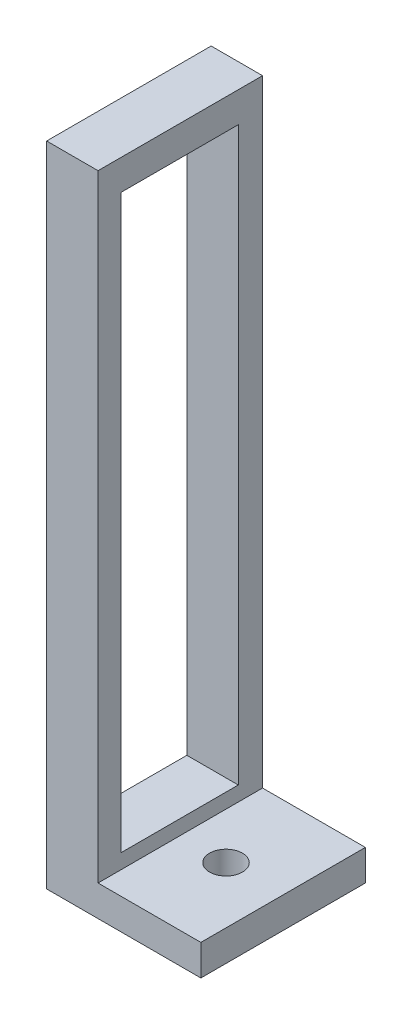
ISO-10303-21;
HEADER;
FILE_DESCRIPTION(('STEP AP214'),'2;1');
FILE_NAME('part.step','',(''),(''),'','','');
FILE_SCHEMA(('AUTOMOTIVE_DESIGN { 1 0 10303 214 1 1 1 1 }'));
ENDSEC;
DATA;
#1=APPLICATION_CONTEXT('core data for automotive mechanical design processes');
#2=APPLICATION_PROTOCOL_DEFINITION('international standard','automotive_design',2000,#1);
#3=PRODUCT_CONTEXT('',#1,'mechanical');
#4=PRODUCT('Part','Part','',(#3));
#5=PRODUCT_RELATED_PRODUCT_CATEGORY('part','',(#4));
#6=PRODUCT_DEFINITION_FORMATION('','',#4);
#7=PRODUCT_DEFINITION_CONTEXT('part definition',#1,'design');
#8=PRODUCT_DEFINITION('design','',#6,#7);
#9=PRODUCT_DEFINITION_SHAPE('','',#8);
#10=(LENGTH_UNIT() NAMED_UNIT(*) SI_UNIT(.MILLI.,.METRE.));
#11=(NAMED_UNIT(*) PLANE_ANGLE_UNIT() SI_UNIT($,.RADIAN.));
#12=(NAMED_UNIT(*) SI_UNIT($,.STERADIAN.) SOLID_ANGLE_UNIT());
#13=UNCERTAINTY_MEASURE_WITH_UNIT(LENGTH_MEASURE(1.E-05),#10,'distance_accuracy_value','');
#14=(GEOMETRIC_REPRESENTATION_CONTEXT(3) GLOBAL_UNCERTAINTY_ASSIGNED_CONTEXT((#13)) GLOBAL_UNIT_ASSIGNED_CONTEXT((#10,
#11,#12)) REPRESENTATION_CONTEXT('',''));
#15=CARTESIAN_POINT('',(0.,0.,0.));
#16=DIRECTION('',(0.,0.,1.));
#17=DIRECTION('',(1.,0.,0.));
#18=AXIS2_PLACEMENT_3D('',#15,#16,#17);
#19=CARTESIAN_POINT('',(0.,0.,16.));
#20=DIRECTION('',(0.,1.,0.));
#21=DIRECTION('',(0.,0.,1.));
#22=AXIS2_PLACEMENT_3D('',#19,#20,#21);
#23=PLANE('',#22);
#24=CARTESIAN_POINT('',(9.50364298724954,0.,8.05893067609577));
#25=DIRECTION('',(0.,1.,0.));
#26=DIRECTION('',(0.,0.,1.));
#27=AXIS2_PLACEMENT_3D('',#24,#25,#26);
#28=CIRCLE('',#27,1.6);
#29=CARTESIAN_POINT('',(9.50364298724954,0.,9.65893067609578));
#30=VERTEX_POINT('',#29);
#31=EDGE_CURVE('E198',#30,#30,#28,.T.);
#32=ORIENTED_EDGE('',*,*,#31,.T.);
#33=EDGE_LOOP('',(#32));
#34=FACE_BOUND('',#33,.T.);
#35=DIRECTION('',(1.,0.,0.));
#36=VECTOR('',#35,1.);
#37=CARTESIAN_POINT('',(0.,0.,0.));
#38=LINE('',#37,#36);
#39=CARTESIAN_POINT('',(0.,0.,0.));
#40=VERTEX_POINT('',#39);
#41=CARTESIAN_POINT('',(15.,0.,0.));
#42=VERTEX_POINT('',#41);
#43=EDGE_CURVE('E138',#40,#42,#38,.T.);
#44=ORIENTED_EDGE('',*,*,#43,.T.);
#45=DIRECTION('',(0.,0.,-1.));
#46=VECTOR('',#45,1.);
#47=CARTESIAN_POINT('',(15.,0.,16.));
#48=LINE('',#47,#46);
#49=CARTESIAN_POINT('',(15.,0.,16.));
#50=VERTEX_POINT('',#49);
#51=EDGE_CURVE('E184',#50,#42,#48,.T.);
#52=ORIENTED_EDGE('',*,*,#51,.F.);
#53=DIRECTION('',(1.,0.,0.));
#54=VECTOR('',#53,1.);
#55=CARTESIAN_POINT('',(0.,0.,16.));
#56=LINE('',#55,#54);
#57=CARTESIAN_POINT('',(0.,0.,16.));
#58=VERTEX_POINT('',#57);
#59=EDGE_CURVE('E141',#58,#50,#56,.T.);
#60=ORIENTED_EDGE('',*,*,#59,.F.);
#61=DIRECTION('',(0.,0.,-1.));
#62=VECTOR('',#61,1.);
#63=CARTESIAN_POINT('',(0.,0.,16.));
#64=LINE('',#63,#62);
#65=EDGE_CURVE('E158',#58,#40,#64,.T.);
#66=ORIENTED_EDGE('',*,*,#65,.T.);
#67=EDGE_LOOP('',(#44,#52,#60,#66));
#68=FACE_BOUND('',#67,.T.);
#69=ADVANCED_FACE('F37',(#34,#68),#23,.F.);
#70=CARTESIAN_POINT('',(15.,0.,16.));
#71=DIRECTION('',(-1.,0.,0.));
#72=DIRECTION('',(0.,0.,1.));
#73=AXIS2_PLACEMENT_3D('',#70,#71,#72);
#74=PLANE('',#73);
#75=DIRECTION('',(0.,1.,0.));
#76=VECTOR('',#75,1.);
#77=CARTESIAN_POINT('',(15.,0.,0.));
#78=LINE('',#77,#76);
#79=CARTESIAN_POINT('',(15.,3.,0.));
#80=VERTEX_POINT('',#79);
#81=EDGE_CURVE('E161',#42,#80,#78,.T.);
#82=ORIENTED_EDGE('',*,*,#81,.T.);
#83=DIRECTION('',(0.,0.,-1.));
#84=VECTOR('',#83,1.);
#85=CARTESIAN_POINT('',(15.,3.,16.));
#86=LINE('',#85,#84);
#87=CARTESIAN_POINT('',(15.,3.,16.));
#88=VERTEX_POINT('',#87);
#89=EDGE_CURVE('E182',#88,#80,#86,.T.);
#90=ORIENTED_EDGE('',*,*,#89,.F.);
#91=DIRECTION('',(0.,1.,0.));
#92=VECTOR('',#91,1.);
#93=CARTESIAN_POINT('',(15.,0.,16.));
#94=LINE('',#93,#92);
#95=EDGE_CURVE('E144',#50,#88,#94,.T.);
#96=ORIENTED_EDGE('',*,*,#95,.F.);
#97=ORIENTED_EDGE('',*,*,#51,.T.);
#98=EDGE_LOOP('',(#82,#90,#96,#97));
#99=FACE_BOUND('',#98,.T.);
#100=ADVANCED_FACE('F212',(#99),#74,.F.);
#101=CARTESIAN_POINT('',(0.,3.,16.));
#102=DIRECTION('',(0.,1.,0.));
#103=DIRECTION('',(0.,0.,1.));
#104=AXIS2_PLACEMENT_3D('',#101,#102,#103);
#105=PLANE('',#104);
#106=CARTESIAN_POINT('',(9.50364298724954,3.,8.05893067609577));
#107=DIRECTION('',(0.,1.,0.));
#108=DIRECTION('',(0.,0.,1.));
#109=AXIS2_PLACEMENT_3D('',#106,#107,#108);
#110=CIRCLE('',#109,1.6);
#111=CARTESIAN_POINT('',(9.50364298724954,3.,9.65893067609578));
#112=VERTEX_POINT('',#111);
#113=EDGE_CURVE('E200',#112,#112,#110,.T.);
#114=ORIENTED_EDGE('',*,*,#113,.F.);
#115=EDGE_LOOP('',(#114));
#116=FACE_BOUND('',#115,.T.);
#117=DIRECTION('',(1.,0.,0.));
#118=VECTOR('',#117,1.);
#119=CARTESIAN_POINT('',(0.,3.,0.));
#120=LINE('',#119,#118);
#121=CARTESIAN_POINT('',(5.,3.,0.));
#122=VERTEX_POINT('',#121);
#123=EDGE_CURVE('E164',#122,#80,#120,.T.);
#124=ORIENTED_EDGE('',*,*,#123,.F.);
#125=DIRECTION('',(0.,0.,-1.));
#126=VECTOR('',#125,1.);
#127=CARTESIAN_POINT('',(5.,3.,16.));
#128=LINE('',#127,#126);
#129=CARTESIAN_POINT('',(5.,3.,16.));
#130=VERTEX_POINT('',#129);
#131=EDGE_CURVE('E180',#130,#122,#128,.T.);
#132=ORIENTED_EDGE('',*,*,#131,.F.);
#133=DIRECTION('',(1.,0.,0.));
#134=VECTOR('',#133,1.);
#135=CARTESIAN_POINT('',(0.,3.,16.));
#136=LINE('',#135,#134);
#137=EDGE_CURVE('E147',#130,#88,#136,.T.);
#138=ORIENTED_EDGE('',*,*,#137,.T.);
#139=ORIENTED_EDGE('',*,*,#89,.T.);
#140=EDGE_LOOP('',(#124,#132,#138,#139));
#141=FACE_BOUND('',#140,.T.);
#142=ADVANCED_FACE('F209',(#116,#141),#105,.T.);
#143=CARTESIAN_POINT('',(5.,0.,16.));
#144=DIRECTION('',(-1.,0.,0.));
#145=DIRECTION('',(0.,0.,1.));
#146=AXIS2_PLACEMENT_3D('',#143,#144,#145);
#147=PLANE('',#146);
#148=DIRECTION('',(0.,0.,-1.));
#149=VECTOR('',#148,1.);
#150=CARTESIAN_POINT('',(5.,4.43703072458426,13.7814731217467));
#151=LINE('',#150,#149);
#152=CARTESIAN_POINT('',(5.,4.43703072458426,13.7814731217467));
#153=VERTEX_POINT('',#152);
#154=CARTESIAN_POINT('',(5.,4.43703072458426,2.36040351927772));
#155=VERTEX_POINT('',#154);
#156=EDGE_CURVE('E124',#153,#155,#151,.T.);
#157=ORIENTED_EDGE('',*,*,#156,.F.);
#158=DIRECTION('',(0.,-1.,0.));
#159=VECTOR('',#158,1.);
#160=CARTESIAN_POINT('',(5.,60.0526740061725,13.7814731217467));
#161=LINE('',#160,#159);
#162=CARTESIAN_POINT('',(5.,60.0526740061725,13.7814731217467));
#163=VERTEX_POINT('',#162);
#164=EDGE_CURVE('E51',#163,#153,#161,.T.);
#165=ORIENTED_EDGE('',*,*,#164,.F.);
#166=DIRECTION('',(0.,0.,1.));
#167=VECTOR('',#166,1.);
#168=CARTESIAN_POINT('',(5.,60.0526740061725,13.7814731217467));
#169=LINE('',#168,#167);
#170=CARTESIAN_POINT('',(5.,60.0526740061725,2.36040351927772));
#171=VERTEX_POINT('',#170);
#172=EDGE_CURVE('E131',#171,#163,#169,.T.);
#173=ORIENTED_EDGE('',*,*,#172,.F.);
#174=DIRECTION('',(0.,1.,0.));
#175=VECTOR('',#174,1.);
#176=CARTESIAN_POINT('',(5.,60.0526740061725,2.36040351927772));
#177=LINE('',#176,#175);
#178=EDGE_CURVE('E115',#155,#171,#177,.T.);
#179=ORIENTED_EDGE('',*,*,#178,.F.);
#180=EDGE_LOOP('',(#157,#165,#173,#179));
#181=FACE_BOUND('',#180,.T.);
#182=DIRECTION('',(0.,1.,0.));
#183=VECTOR('',#182,1.);
#184=CARTESIAN_POINT('',(5.,0.,0.));
#185=LINE('',#184,#183);
#186=CARTESIAN_POINT('',(5.,63.,0.));
#187=VERTEX_POINT('',#186);
#188=EDGE_CURVE('E167',#122,#187,#185,.T.);
#189=ORIENTED_EDGE('',*,*,#188,.T.);
#190=DIRECTION('',(0.,0.,-1.));
#191=VECTOR('',#190,1.);
#192=CARTESIAN_POINT('',(5.,63.,16.));
#193=LINE('',#192,#191);
#194=CARTESIAN_POINT('',(5.,63.,16.));
#195=VERTEX_POINT('',#194);
#196=EDGE_CURVE('E178',#195,#187,#193,.T.);
#197=ORIENTED_EDGE('',*,*,#196,.F.);
#198=DIRECTION('',(0.,1.,0.));
#199=VECTOR('',#198,1.);
#200=CARTESIAN_POINT('',(5.,0.,16.));
#201=LINE('',#200,#199);
#202=EDGE_CURVE('E150',#130,#195,#201,.T.);
#203=ORIENTED_EDGE('',*,*,#202,.F.);
#204=ORIENTED_EDGE('',*,*,#131,.T.);
#205=EDGE_LOOP('',(#189,#197,#203,#204));
#206=FACE_BOUND('',#205,.T.);
#207=ADVANCED_FACE('F128',(#181,#206),#147,.F.);
#208=CARTESIAN_POINT('',(0.,63.,16.));
#209=DIRECTION('',(0.,1.,0.));
#210=DIRECTION('',(0.,0.,1.));
#211=AXIS2_PLACEMENT_3D('',#208,#209,#210);
#212=PLANE('',#211);
#213=DIRECTION('',(1.,0.,0.));
#214=VECTOR('',#213,1.);
#215=CARTESIAN_POINT('',(0.,63.,0.));
#216=LINE('',#215,#214);
#217=CARTESIAN_POINT('',(0.,63.,0.));
#218=VERTEX_POINT('',#217);
#219=EDGE_CURVE('E170',#218,#187,#216,.T.);
#220=ORIENTED_EDGE('',*,*,#219,.F.);
#221=DIRECTION('',(0.,0.,-1.));
#222=VECTOR('',#221,1.);
#223=CARTESIAN_POINT('',(0.,63.,16.));
#224=LINE('',#223,#222);
#225=CARTESIAN_POINT('',(0.,63.,16.));
#226=VERTEX_POINT('',#225);
#227=EDGE_CURVE('E176',#226,#218,#224,.T.);
#228=ORIENTED_EDGE('',*,*,#227,.F.);
#229=DIRECTION('',(1.,0.,0.));
#230=VECTOR('',#229,1.);
#231=CARTESIAN_POINT('',(0.,63.,16.));
#232=LINE('',#231,#230);
#233=EDGE_CURVE('E152',#226,#195,#232,.T.);
#234=ORIENTED_EDGE('',*,*,#233,.T.);
#235=ORIENTED_EDGE('',*,*,#196,.T.);
#236=EDGE_LOOP('',(#220,#228,#234,#235));
#237=FACE_BOUND('',#236,.T.);
#238=ADVANCED_FACE('F234',(#237),#212,.T.);
#239=CARTESIAN_POINT('',(0.,0.,16.));
#240=DIRECTION('',(-1.,0.,0.));
#241=DIRECTION('',(0.,0.,1.));
#242=AXIS2_PLACEMENT_3D('',#239,#240,#241);
#243=PLANE('',#242);
#244=DIRECTION('',(0.,1.,0.));
#245=VECTOR('',#244,1.);
#246=CARTESIAN_POINT('',(0.,0.,13.7814731217467));
#247=LINE('',#246,#245);
#248=CARTESIAN_POINT('',(0.,4.43703072458426,13.7814731217467));
#249=VERTEX_POINT('',#248);
#250=CARTESIAN_POINT('',(0.,60.0526740061725,13.7814731217467));
#251=VERTEX_POINT('',#250);
#252=EDGE_CURVE('E11',#249,#251,#247,.T.);
#253=ORIENTED_EDGE('',*,*,#252,.F.);
#254=DIRECTION('',(0.,0.,1.));
#255=VECTOR('',#254,1.);
#256=CARTESIAN_POINT('',(0.,4.43703072458426,16.));
#257=LINE('',#256,#255);
#258=CARTESIAN_POINT('',(0.,4.43703072458426,2.36040351927772));
#259=VERTEX_POINT('',#258);
#260=EDGE_CURVE('E187',#259,#249,#257,.T.);
#261=ORIENTED_EDGE('',*,*,#260,.F.);
#262=DIRECTION('',(0.,-1.,0.));
#263=VECTOR('',#262,1.);
#264=CARTESIAN_POINT('',(0.,0.,2.36040351927772));
#265=LINE('',#264,#263);
#266=CARTESIAN_POINT('',(0.,60.0526740061725,2.36040351927772));
#267=VERTEX_POINT('',#266);
#268=EDGE_CURVE('E118',#267,#259,#265,.T.);
#269=ORIENTED_EDGE('',*,*,#268,.F.);
#270=DIRECTION('',(0.,0.,-1.));
#271=VECTOR('',#270,1.);
#272=CARTESIAN_POINT('',(0.,60.0526740061725,16.));
#273=LINE('',#272,#271);
#274=EDGE_CURVE('E44',#251,#267,#273,.T.);
#275=ORIENTED_EDGE('',*,*,#274,.F.);
#276=EDGE_LOOP('',(#253,#261,#269,#275));
#277=FACE_BOUND('',#276,.T.);
#278=DIRECTION('',(0.,1.,0.));
#279=VECTOR('',#278,1.);
#280=CARTESIAN_POINT('',(0.,0.,0.));
#281=LINE('',#280,#279);
#282=EDGE_CURVE('E145',#40,#218,#281,.T.);
#283=ORIENTED_EDGE('',*,*,#282,.F.);
#284=ORIENTED_EDGE('',*,*,#65,.F.);
#285=DIRECTION('',(0.,1.,0.));
#286=VECTOR('',#285,1.);
#287=CARTESIAN_POINT('',(0.,0.,16.));
#288=LINE('',#287,#286);
#289=EDGE_CURVE('E155',#58,#226,#288,.T.);
#290=ORIENTED_EDGE('',*,*,#289,.T.);
#291=ORIENTED_EDGE('',*,*,#227,.T.);
#292=EDGE_LOOP('',(#283,#284,#290,#291));
#293=FACE_BOUND('',#292,.T.);
#294=ADVANCED_FACE('F195',(#277,#293),#243,.T.);
#295=CARTESIAN_POINT('',(0.,0.,16.));
#296=DIRECTION('',(0.,0.,1.));
#297=DIRECTION('',(1.,0.,0.));
#298=AXIS2_PLACEMENT_3D('',#295,#296,#297);
#299=PLANE('',#298);
#300=ORIENTED_EDGE('',*,*,#59,.T.);
#301=ORIENTED_EDGE('',*,*,#95,.T.);
#302=ORIENTED_EDGE('',*,*,#137,.F.);
#303=ORIENTED_EDGE('',*,*,#202,.T.);
#304=ORIENTED_EDGE('',*,*,#233,.F.);
#305=ORIENTED_EDGE('',*,*,#289,.F.);
#306=EDGE_LOOP('',(#300,#301,#302,#303,#304,#305));
#307=FACE_BOUND('',#306,.T.);
#308=ADVANCED_FACE('F226',(#307),#299,.T.);
#309=CARTESIAN_POINT('',(0.,0.,0.));
#310=DIRECTION('',(0.,0.,1.));
#311=DIRECTION('',(1.,0.,0.));
#312=AXIS2_PLACEMENT_3D('',#309,#310,#311);
#313=PLANE('',#312);
#314=ORIENTED_EDGE('',*,*,#43,.F.);
#315=ORIENTED_EDGE('',*,*,#282,.T.);
#316=ORIENTED_EDGE('',*,*,#219,.T.);
#317=ORIENTED_EDGE('',*,*,#188,.F.);
#318=ORIENTED_EDGE('',*,*,#123,.T.);
#319=ORIENTED_EDGE('',*,*,#81,.F.);
#320=EDGE_LOOP('',(#314,#315,#316,#317,#318,#319));
#321=FACE_BOUND('',#320,.T.);
#322=ADVANCED_FACE('F220',(#321),#313,.F.);
#323=CARTESIAN_POINT('',(-11.,60.0526740061725,13.7814731217467));
#324=DIRECTION('',(0.,0.,1.));
#325=DIRECTION('',(1.,0.,0.));
#326=AXIS2_PLACEMENT_3D('',#323,#324,#325);
#327=PLANE('',#326);
#328=ORIENTED_EDGE('',*,*,#252,.T.);
#329=DIRECTION('',(1.,0.,0.));
#330=VECTOR('',#329,1.);
#331=CARTESIAN_POINT('',(-11.,60.0526740061725,13.7814731217467));
#332=LINE('',#331,#330);
#333=EDGE_CURVE('E136',#251,#163,#332,.T.);
#334=ORIENTED_EDGE('',*,*,#333,.T.);
#335=ORIENTED_EDGE('',*,*,#164,.T.);
#336=DIRECTION('',(1.,0.,0.));
#337=VECTOR('',#336,1.);
#338=CARTESIAN_POINT('',(-11.,4.43703072458426,13.7814731217467));
#339=LINE('',#338,#337);
#340=EDGE_CURVE('E121',#249,#153,#339,.T.);
#341=ORIENTED_EDGE('',*,*,#340,.F.);
#342=EDGE_LOOP('',(#328,#334,#335,#341));
#343=FACE_BOUND('',#342,.T.);
#344=ADVANCED_FACE('F197',(#343),#327,.F.);
#345=CARTESIAN_POINT('',(-11.,60.0526740061725,13.7814731217467));
#346=DIRECTION('',(0.,1.,0.));
#347=DIRECTION('',(0.,0.,1.));
#348=AXIS2_PLACEMENT_3D('',#345,#346,#347);
#349=PLANE('',#348);
#350=ORIENTED_EDGE('',*,*,#274,.T.);
#351=DIRECTION('',(1.,0.,0.));
#352=VECTOR('',#351,1.);
#353=CARTESIAN_POINT('',(-11.,60.0526740061725,2.36040351927772));
#354=LINE('',#353,#352);
#355=EDGE_CURVE('E120',#267,#171,#354,.T.);
#356=ORIENTED_EDGE('',*,*,#355,.T.);
#357=ORIENTED_EDGE('',*,*,#172,.T.);
#358=ORIENTED_EDGE('',*,*,#333,.F.);
#359=EDGE_LOOP('',(#350,#356,#357,#358));
#360=FACE_BOUND('',#359,.T.);
#361=ADVANCED_FACE('F192',(#360),#349,.F.);
#362=CARTESIAN_POINT('',(-11.,60.0526740061725,2.36040351927772));
#363=DIRECTION('',(0.,0.,-1.));
#364=DIRECTION('',(-1.,0.,0.));
#365=AXIS2_PLACEMENT_3D('',#362,#363,#364);
#366=PLANE('',#365);
#367=ORIENTED_EDGE('',*,*,#268,.T.);
#368=DIRECTION('',(1.,0.,0.));
#369=VECTOR('',#368,1.);
#370=CARTESIAN_POINT('',(-11.,4.43703072458426,2.36040351927772));
#371=LINE('',#370,#369);
#372=EDGE_CURVE('E59',#259,#155,#371,.T.);
#373=ORIENTED_EDGE('',*,*,#372,.T.);
#374=ORIENTED_EDGE('',*,*,#178,.T.);
#375=ORIENTED_EDGE('',*,*,#355,.F.);
#376=EDGE_LOOP('',(#367,#373,#374,#375));
#377=FACE_BOUND('',#376,.T.);
#378=ADVANCED_FACE('F112',(#377),#366,.F.);
#379=CARTESIAN_POINT('',(-11.,4.43703072458426,13.7814731217467));
#380=DIRECTION('',(0.,-1.,0.));
#381=DIRECTION('',(0.,0.,-1.));
#382=AXIS2_PLACEMENT_3D('',#379,#380,#381);
#383=PLANE('',#382);
#384=ORIENTED_EDGE('',*,*,#260,.T.);
#385=ORIENTED_EDGE('',*,*,#340,.T.);
#386=ORIENTED_EDGE('',*,*,#156,.T.);
#387=ORIENTED_EDGE('',*,*,#372,.F.);
#388=EDGE_LOOP('',(#384,#385,#386,#387));
#389=FACE_BOUND('',#388,.T.);
#390=ADVANCED_FACE('F125',(#389),#383,.F.);
#391=CARTESIAN_POINT('',(9.50364298724954,-13.,8.05893067609577));
#392=DIRECTION('',(0.,1.,0.));
#393=DIRECTION('',(0.,0.,1.));
#394=AXIS2_PLACEMENT_3D('',#391,#392,#393);
#395=CYLINDRICAL_SURFACE('',#394,1.6);
#396=ORIENTED_EDGE('',*,*,#113,.T.);
#397=EDGE_LOOP('',(#396));
#398=FACE_BOUND('',#397,.T.);
#399=ORIENTED_EDGE('',*,*,#31,.F.);
#400=EDGE_LOOP('',(#399));
#401=FACE_BOUND('',#400,.T.);
#402=ADVANCED_FACE('F206',(#398,#401),#395,.F.);
#403=CLOSED_SHELL('',(#69,#100,#142,#207,#238,#294,#308,#322,#344,#361,#378,#390,#402));
#404=MANIFOLD_SOLID_BREP('B2',#403);
#405=ADVANCED_BREP_SHAPE_REPRESENTATION('',(#18,#404),#14);
#406=SHAPE_DEFINITION_REPRESENTATION(#9,#405);
ENDSEC;
END-ISO-10303-21;
